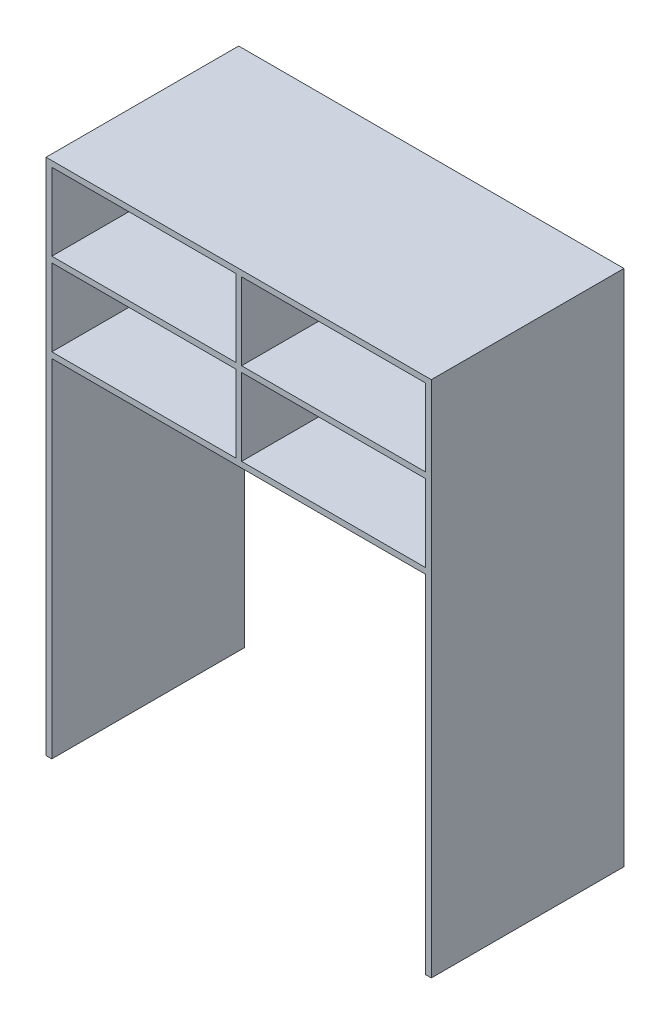
ISO-10303-21;
HEADER;
FILE_DESCRIPTION(('STEP AP214'),'2;1');
FILE_NAME('part.step','',(''),(''),'','','');
FILE_SCHEMA(('AUTOMOTIVE_DESIGN { 1 0 10303 214 1 1 1 1 }'));
ENDSEC;
DATA;
#1=APPLICATION_CONTEXT('core data for automotive mechanical design processes');
#2=APPLICATION_PROTOCOL_DEFINITION('international standard','automotive_design',2000,#1);
#3=PRODUCT_CONTEXT('',#1,'mechanical');
#4=PRODUCT('Part','Part','',(#3));
#5=PRODUCT_RELATED_PRODUCT_CATEGORY('part','',(#4));
#6=PRODUCT_DEFINITION_FORMATION('','',#4);
#7=PRODUCT_DEFINITION_CONTEXT('part definition',#1,'design');
#8=PRODUCT_DEFINITION('design','',#6,#7);
#9=PRODUCT_DEFINITION_SHAPE('','',#8);
#10=(LENGTH_UNIT() NAMED_UNIT(*) SI_UNIT(.MILLI.,.METRE.));
#11=(NAMED_UNIT(*) PLANE_ANGLE_UNIT() SI_UNIT($,.RADIAN.));
#12=(NAMED_UNIT(*) SI_UNIT($,.STERADIAN.) SOLID_ANGLE_UNIT());
#13=UNCERTAINTY_MEASURE_WITH_UNIT(LENGTH_MEASURE(1.E-05),#10,'distance_accuracy_value','');
#14=(GEOMETRIC_REPRESENTATION_CONTEXT(3) GLOBAL_UNCERTAINTY_ASSIGNED_CONTEXT((#13)) GLOBAL_UNIT_ASSIGNED_CONTEXT((#10,
#11,#12)) REPRESENTATION_CONTEXT('',''));
#15=CARTESIAN_POINT('',(0.,0.,0.));
#16=DIRECTION('',(0.,0.,1.));
#17=DIRECTION('',(1.,0.,0.));
#18=AXIS2_PLACEMENT_3D('',#15,#16,#17);
#19=CARTESIAN_POINT('',(0.,0.,100.));
#20=DIRECTION('',(0.,0.,-1.));
#21=DIRECTION('',(-1.,0.,0.));
#22=AXIS2_PLACEMENT_3D('',#19,#20,#21);
#23=PLANE('',#22);
#24=DIRECTION('',(1.,0.,0.));
#25=VECTOR('',#24,1.);
#26=CARTESIAN_POINT('',(97.,45.9999999999998,100.));
#27=LINE('',#26,#25);
#28=CARTESIAN_POINT('',(1.49999999999993,46.,100.));
#29=VERTEX_POINT('',#28);
#30=CARTESIAN_POINT('',(97.,45.9999999999998,100.));
#31=VERTEX_POINT('',#30);
#32=EDGE_CURVE('E238',#29,#31,#27,.T.);
#33=ORIENTED_EDGE('',*,*,#32,.F.);
#34=DIRECTION('',(0.,-1.,0.));
#35=VECTOR('',#34,1.);
#36=CARTESIAN_POINT('',(1.49999999999993,46.,100.));
#37=LINE('',#36,#35);
#38=CARTESIAN_POINT('',(1.49999999999992,85.9999999999994,100.));
#39=VERTEX_POINT('',#38);
#40=EDGE_CURVE('E246',#39,#29,#37,.T.);
#41=ORIENTED_EDGE('',*,*,#40,.F.);
#42=DIRECTION('',(-1.,0.,0.));
#43=VECTOR('',#42,1.);
#44=CARTESIAN_POINT('',(1.49999999999992,85.9999999999994,100.));
#45=LINE('',#44,#43);
#46=CARTESIAN_POINT('',(97.,85.9999999999994,100.));
#47=VERTEX_POINT('',#46);
#48=EDGE_CURVE('E243',#47,#39,#45,.T.);
#49=ORIENTED_EDGE('',*,*,#48,.F.);
#50=DIRECTION('',(0.,1.,0.));
#51=VECTOR('',#50,1.);
#52=CARTESIAN_POINT('',(97.,85.9999999999994,100.));
#53=LINE('',#52,#51);
#54=EDGE_CURVE('E240',#31,#47,#53,.T.);
#55=ORIENTED_EDGE('',*,*,#54,.F.);
#56=EDGE_LOOP('',(#33,#41,#49,#55));
#57=FACE_BOUND('',#56,.T.);
#58=DIRECTION('',(1.,0.,0.));
#59=VECTOR('',#58,1.);
#60=CARTESIAN_POINT('',(-1.50000000000001,3.,100.));
#61=LINE('',#60,#59);
#62=CARTESIAN_POINT('',(-97.,3.00000000000001,100.));
#63=VERTEX_POINT('',#62);
#64=CARTESIAN_POINT('',(-1.50000000000001,3.,100.));
#65=VERTEX_POINT('',#64);
#66=EDGE_CURVE('E300',#63,#65,#61,.T.);
#67=ORIENTED_EDGE('',*,*,#66,.F.);
#68=DIRECTION('',(0.,-1.,0.));
#69=VECTOR('',#68,1.);
#70=CARTESIAN_POINT('',(-97.,3.00000000000001,100.));
#71=LINE('',#70,#69);
#72=CARTESIAN_POINT('',(-97.,43.,100.));
#73=VERTEX_POINT('',#72);
#74=EDGE_CURVE('E308',#73,#63,#71,.T.);
#75=ORIENTED_EDGE('',*,*,#74,.F.);
#76=DIRECTION('',(-1.,0.,0.));
#77=VECTOR('',#76,1.);
#78=CARTESIAN_POINT('',(-97.,43.,100.));
#79=LINE('',#78,#77);
#80=CARTESIAN_POINT('',(-1.50000000000002,43.,100.));
#81=VERTEX_POINT('',#80);
#82=EDGE_CURVE('E305',#81,#73,#79,.T.);
#83=ORIENTED_EDGE('',*,*,#82,.F.);
#84=DIRECTION('',(0.,1.,0.));
#85=VECTOR('',#84,1.);
#86=CARTESIAN_POINT('',(-1.50000000000002,43.,100.));
#87=LINE('',#86,#85);
#88=EDGE_CURVE('E302',#65,#81,#87,.T.);
#89=ORIENTED_EDGE('',*,*,#88,.F.);
#90=EDGE_LOOP('',(#67,#75,#83,#89));
#91=FACE_BOUND('',#90,.T.);
#92=DIRECTION('',(0.,1.,0.));
#93=VECTOR('',#92,1.);
#94=CARTESIAN_POINT('',(-97.,-180.,100.));
#95=LINE('',#94,#93);
#96=CARTESIAN_POINT('',(-97.,-180.,100.));
#97=VERTEX_POINT('',#96);
#98=CARTESIAN_POINT('',(-97.0000000000001,0.,100.));
#99=VERTEX_POINT('',#98);
#100=EDGE_CURVE('E331',#97,#99,#95,.T.);
#101=ORIENTED_EDGE('',*,*,#100,.T.);
#102=DIRECTION('',(1.,0.,0.));
#103=VECTOR('',#102,1.);
#104=CARTESIAN_POINT('',(-97.0000000000001,0.,100.));
#105=LINE('',#104,#103);
#106=CARTESIAN_POINT('',(97.0000000000001,0.,100.));
#107=VERTEX_POINT('',#106);
#108=EDGE_CURVE('E334',#99,#107,#105,.T.);
#109=ORIENTED_EDGE('',*,*,#108,.T.);
#110=DIRECTION('',(0.,-1.,0.));
#111=VECTOR('',#110,1.);
#112=CARTESIAN_POINT('',(97.0000000000001,0.,100.));
#113=LINE('',#112,#111);
#114=CARTESIAN_POINT('',(97.,-180.,100.));
#115=VERTEX_POINT('',#114);
#116=EDGE_CURVE('E337',#107,#115,#113,.T.);
#117=ORIENTED_EDGE('',*,*,#116,.T.);
#118=DIRECTION('',(1.,0.,0.));
#119=VECTOR('',#118,1.);
#120=CARTESIAN_POINT('',(97.,-180.,100.));
#121=LINE('',#120,#119);
#122=CARTESIAN_POINT('',(100.,-180.,100.));
#123=VERTEX_POINT('',#122);
#124=EDGE_CURVE('E339',#115,#123,#121,.T.);
#125=ORIENTED_EDGE('',*,*,#124,.T.);
#126=DIRECTION('',(0.,1.,0.));
#127=VECTOR('',#126,1.);
#128=CARTESIAN_POINT('',(100.,-180.,100.));
#129=LINE('',#128,#127);
#130=CARTESIAN_POINT('',(100.,88.9999999999994,100.));
#131=VERTEX_POINT('',#130);
#132=EDGE_CURVE('E341',#123,#131,#129,.T.);
#133=ORIENTED_EDGE('',*,*,#132,.T.);
#134=DIRECTION('',(-1.,0.,0.));
#135=VECTOR('',#134,1.);
#136=CARTESIAN_POINT('',(100.,88.9999999999994,100.));
#137=LINE('',#136,#135);
#138=CARTESIAN_POINT('',(-100.,88.9999999999994,100.));
#139=VERTEX_POINT('',#138);
#140=EDGE_CURVE('E343',#131,#139,#137,.T.);
#141=ORIENTED_EDGE('',*,*,#140,.T.);
#142=DIRECTION('',(0.,-1.,0.));
#143=VECTOR('',#142,1.);
#144=CARTESIAN_POINT('',(-100.,88.9999999999994,100.));
#145=LINE('',#144,#143);
#146=CARTESIAN_POINT('',(-100.,-180.,100.));
#147=VERTEX_POINT('',#146);
#148=EDGE_CURVE('E345',#139,#147,#145,.T.);
#149=ORIENTED_EDGE('',*,*,#148,.T.);
#150=DIRECTION('',(1.,0.,0.));
#151=VECTOR('',#150,1.);
#152=CARTESIAN_POINT('',(-100.,-180.,100.));
#153=LINE('',#152,#151);
#154=EDGE_CURVE('E347',#147,#97,#153,.T.);
#155=ORIENTED_EDGE('',*,*,#154,.T.);
#156=EDGE_LOOP('',(#101,#109,#117,#125,#133,#141,#149,#155));
#157=FACE_BOUND('',#156,.T.);
#158=DIRECTION('',(1.,0.,0.));
#159=VECTOR('',#158,1.);
#160=CARTESIAN_POINT('',(-1.49999999999993,46.,100.));
#161=LINE('',#160,#159);
#162=CARTESIAN_POINT('',(-97.0000000000001,45.9999999999994,100.));
#163=VERTEX_POINT('',#162);
#164=CARTESIAN_POINT('',(-1.49999999999993,46.,100.));
#165=VERTEX_POINT('',#164);
#166=EDGE_CURVE('E269',#163,#165,#161,.T.);
#167=ORIENTED_EDGE('',*,*,#166,.F.);
#168=DIRECTION('',(0.,-1.,0.));
#169=VECTOR('',#168,1.);
#170=CARTESIAN_POINT('',(-97.0000000000001,45.9999999999994,100.));
#171=LINE('',#170,#169);
#172=CARTESIAN_POINT('',(-97.,85.9999999999994,100.));
#173=VERTEX_POINT('',#172);
#174=EDGE_CURVE('E277',#173,#163,#171,.T.);
#175=ORIENTED_EDGE('',*,*,#174,.F.);
#176=DIRECTION('',(-1.,0.,0.));
#177=VECTOR('',#176,1.);
#178=CARTESIAN_POINT('',(-97.,85.9999999999994,100.));
#179=LINE('',#178,#177);
#180=CARTESIAN_POINT('',(-1.50000000000003,85.9999999999994,100.));
#181=VERTEX_POINT('',#180);
#182=EDGE_CURVE('E274',#181,#173,#179,.T.);
#183=ORIENTED_EDGE('',*,*,#182,.F.);
#184=DIRECTION('',(0.,1.,0.));
#185=VECTOR('',#184,1.);
#186=CARTESIAN_POINT('',(-1.50000000000003,85.9999999999994,100.));
#187=LINE('',#186,#185);
#188=EDGE_CURVE('E271',#165,#181,#187,.T.);
#189=ORIENTED_EDGE('',*,*,#188,.F.);
#190=EDGE_LOOP('',(#167,#175,#183,#189));
#191=FACE_BOUND('',#190,.T.);
#192=DIRECTION('',(-1.,0.,0.));
#193=VECTOR('',#192,1.);
#194=CARTESIAN_POINT('',(1.50000000000002,43.,100.));
#195=LINE('',#194,#193);
#196=CARTESIAN_POINT('',(97.,43.,100.));
#197=VERTEX_POINT('',#196);
#198=CARTESIAN_POINT('',(1.50000000000002,43.,100.));
#199=VERTEX_POINT('',#198);
#200=EDGE_CURVE('E202',#197,#199,#195,.T.);
#201=ORIENTED_EDGE('',*,*,#200,.F.);
#202=DIRECTION('',(0.,1.,0.));
#203=VECTOR('',#202,1.);
#204=CARTESIAN_POINT('',(97.,43.,100.));
#205=LINE('',#204,#203);
#206=CARTESIAN_POINT('',(97.,3.00000000000001,100.));
#207=VERTEX_POINT('',#206);
#208=EDGE_CURVE('E224',#207,#197,#205,.T.);
#209=ORIENTED_EDGE('',*,*,#208,.F.);
#210=DIRECTION('',(1.,0.,0.));
#211=VECTOR('',#210,1.);
#212=CARTESIAN_POINT('',(1.49999999999993,3.,100.));
#213=LINE('',#212,#211);
#214=CARTESIAN_POINT('',(1.49999999999993,3.,100.));
#215=VERTEX_POINT('',#214);
#216=EDGE_CURVE('E222',#215,#207,#213,.T.);
#217=ORIENTED_EDGE('',*,*,#216,.F.);
#218=DIRECTION('',(0.,-1.,0.));
#219=VECTOR('',#218,1.);
#220=CARTESIAN_POINT('',(1.50000000000002,43.,100.));
#221=LINE('',#220,#219);
#222=EDGE_CURVE('E210',#199,#215,#221,.T.);
#223=ORIENTED_EDGE('',*,*,#222,.F.);
#224=EDGE_LOOP('',(#201,#209,#217,#223));
#225=FACE_BOUND('',#224,.T.);
#226=ADVANCED_FACE('F41',(#57,#91,#157,#191,#225),#23,.F.);
#227=CARTESIAN_POINT('',(0.,0.,0.));
#228=DIRECTION('',(0.,0.,-1.));
#229=DIRECTION('',(-1.,0.,0.));
#230=AXIS2_PLACEMENT_3D('',#227,#228,#229);
#231=PLANE('',#230);
#232=DIRECTION('',(0.,1.,0.));
#233=VECTOR('',#232,1.);
#234=CARTESIAN_POINT('',(-97.,-180.,0.));
#235=LINE('',#234,#233);
#236=CARTESIAN_POINT('',(-97.,-180.,0.));
#237=VERTEX_POINT('',#236);
#238=CARTESIAN_POINT('',(-97.0000000000001,0.,0.));
#239=VERTEX_POINT('',#238);
#240=EDGE_CURVE('E330',#237,#239,#235,.T.);
#241=ORIENTED_EDGE('',*,*,#240,.F.);
#242=DIRECTION('',(1.,0.,0.));
#243=VECTOR('',#242,1.);
#244=CARTESIAN_POINT('',(-100.,-180.,0.));
#245=LINE('',#244,#243);
#246=CARTESIAN_POINT('',(-100.,-180.,0.));
#247=VERTEX_POINT('',#246);
#248=EDGE_CURVE('E335',#247,#237,#245,.T.);
#249=ORIENTED_EDGE('',*,*,#248,.F.);
#250=DIRECTION('',(0.,-1.,0.));
#251=VECTOR('',#250,1.);
#252=CARTESIAN_POINT('',(-100.,88.9999999999994,0.));
#253=LINE('',#252,#251);
#254=CARTESIAN_POINT('',(-100.,88.9999999999994,0.));
#255=VERTEX_POINT('',#254);
#256=EDGE_CURVE('E362',#255,#247,#253,.T.);
#257=ORIENTED_EDGE('',*,*,#256,.F.);
#258=DIRECTION('',(-1.,0.,0.));
#259=VECTOR('',#258,1.);
#260=CARTESIAN_POINT('',(100.,88.9999999999994,0.));
#261=LINE('',#260,#259);
#262=CARTESIAN_POINT('',(100.,88.9999999999994,0.));
#263=VERTEX_POINT('',#262);
#264=EDGE_CURVE('E360',#263,#255,#261,.T.);
#265=ORIENTED_EDGE('',*,*,#264,.F.);
#266=DIRECTION('',(0.,1.,0.));
#267=VECTOR('',#266,1.);
#268=CARTESIAN_POINT('',(100.,-180.,0.));
#269=LINE('',#268,#267);
#270=CARTESIAN_POINT('',(100.,-180.,0.));
#271=VERTEX_POINT('',#270);
#272=EDGE_CURVE('E358',#271,#263,#269,.T.);
#273=ORIENTED_EDGE('',*,*,#272,.F.);
#274=DIRECTION('',(1.,0.,0.));
#275=VECTOR('',#274,1.);
#276=CARTESIAN_POINT('',(97.,-180.,0.));
#277=LINE('',#276,#275);
#278=CARTESIAN_POINT('',(97.,-180.,0.));
#279=VERTEX_POINT('',#278);
#280=EDGE_CURVE('E356',#279,#271,#277,.T.);
#281=ORIENTED_EDGE('',*,*,#280,.F.);
#282=DIRECTION('',(0.,-1.,0.));
#283=VECTOR('',#282,1.);
#284=CARTESIAN_POINT('',(97.0000000000001,0.,0.));
#285=LINE('',#284,#283);
#286=CARTESIAN_POINT('',(97.0000000000001,0.,0.));
#287=VERTEX_POINT('',#286);
#288=EDGE_CURVE('E354',#287,#279,#285,.T.);
#289=ORIENTED_EDGE('',*,*,#288,.F.);
#290=DIRECTION('',(1.,0.,0.));
#291=VECTOR('',#290,1.);
#292=CARTESIAN_POINT('',(-97.0000000000001,0.,0.));
#293=LINE('',#292,#291);
#294=EDGE_CURVE('E352',#239,#287,#293,.T.);
#295=ORIENTED_EDGE('',*,*,#294,.F.);
#296=EDGE_LOOP('',(#241,#249,#257,#265,#273,#281,#289,#295));
#297=FACE_BOUND('',#296,.T.);
#298=DIRECTION('',(0.,-1.,0.));
#299=VECTOR('',#298,1.);
#300=CARTESIAN_POINT('',(-97.,3.00000000000001,0.));
#301=LINE('',#300,#299);
#302=CARTESIAN_POINT('',(-97.,43.,0.));
#303=VERTEX_POINT('',#302);
#304=CARTESIAN_POINT('',(-97.,3.00000000000001,0.));
#305=VERTEX_POINT('',#304);
#306=EDGE_CURVE('E303',#303,#305,#301,.T.);
#307=ORIENTED_EDGE('',*,*,#306,.T.);
#308=DIRECTION('',(1.,0.,0.));
#309=VECTOR('',#308,1.);
#310=CARTESIAN_POINT('',(-1.50000000000001,3.,0.));
#311=LINE('',#310,#309);
#312=CARTESIAN_POINT('',(-1.50000000000001,3.,0.));
#313=VERTEX_POINT('',#312);
#314=EDGE_CURVE('E299',#305,#313,#311,.T.);
#315=ORIENTED_EDGE('',*,*,#314,.T.);
#316=DIRECTION('',(0.,1.,0.));
#317=VECTOR('',#316,1.);
#318=CARTESIAN_POINT('',(-1.50000000000002,43.,0.));
#319=LINE('',#318,#317);
#320=CARTESIAN_POINT('',(-1.50000000000002,43.,0.));
#321=VERTEX_POINT('',#320);
#322=EDGE_CURVE('E313',#313,#321,#319,.T.);
#323=ORIENTED_EDGE('',*,*,#322,.T.);
#324=DIRECTION('',(-1.,0.,0.));
#325=VECTOR('',#324,1.);
#326=CARTESIAN_POINT('',(-97.,43.,0.));
#327=LINE('',#326,#325);
#328=EDGE_CURVE('E316',#321,#303,#327,.T.);
#329=ORIENTED_EDGE('',*,*,#328,.T.);
#330=EDGE_LOOP('',(#307,#315,#323,#329));
#331=FACE_BOUND('',#330,.T.);
#332=DIRECTION('',(0.,-1.,0.));
#333=VECTOR('',#332,1.);
#334=CARTESIAN_POINT('',(-97.0000000000001,45.9999999999994,0.));
#335=LINE('',#334,#333);
#336=CARTESIAN_POINT('',(-97.,85.9999999999994,0.));
#337=VERTEX_POINT('',#336);
#338=CARTESIAN_POINT('',(-97.0000000000001,45.9999999999994,0.));
#339=VERTEX_POINT('',#338);
#340=EDGE_CURVE('E272',#337,#339,#335,.T.);
#341=ORIENTED_EDGE('',*,*,#340,.T.);
#342=DIRECTION('',(1.,0.,0.));
#343=VECTOR('',#342,1.);
#344=CARTESIAN_POINT('',(-1.49999999999993,46.,0.));
#345=LINE('',#344,#343);
#346=CARTESIAN_POINT('',(-1.49999999999993,46.,0.));
#347=VERTEX_POINT('',#346);
#348=EDGE_CURVE('E268',#339,#347,#345,.T.);
#349=ORIENTED_EDGE('',*,*,#348,.T.);
#350=DIRECTION('',(0.,1.,0.));
#351=VECTOR('',#350,1.);
#352=CARTESIAN_POINT('',(-1.50000000000003,85.9999999999994,0.));
#353=LINE('',#352,#351);
#354=CARTESIAN_POINT('',(-1.50000000000003,85.9999999999994,0.));
#355=VERTEX_POINT('',#354);
#356=EDGE_CURVE('E282',#347,#355,#353,.T.);
#357=ORIENTED_EDGE('',*,*,#356,.T.);
#358=DIRECTION('',(-1.,0.,0.));
#359=VECTOR('',#358,1.);
#360=CARTESIAN_POINT('',(-97.,85.9999999999994,0.));
#361=LINE('',#360,#359);
#362=EDGE_CURVE('E285',#355,#337,#361,.T.);
#363=ORIENTED_EDGE('',*,*,#362,.T.);
#364=EDGE_LOOP('',(#341,#349,#357,#363));
#365=FACE_BOUND('',#364,.T.);
#366=DIRECTION('',(0.,-1.,0.));
#367=VECTOR('',#366,1.);
#368=CARTESIAN_POINT('',(1.49999999999993,46.,0.));
#369=LINE('',#368,#367);
#370=CARTESIAN_POINT('',(1.49999999999992,85.9999999999994,0.));
#371=VERTEX_POINT('',#370);
#372=CARTESIAN_POINT('',(1.49999999999993,46.,0.));
#373=VERTEX_POINT('',#372);
#374=EDGE_CURVE('E241',#371,#373,#369,.T.);
#375=ORIENTED_EDGE('',*,*,#374,.T.);
#376=DIRECTION('',(1.,0.,0.));
#377=VECTOR('',#376,1.);
#378=CARTESIAN_POINT('',(97.,45.9999999999998,0.));
#379=LINE('',#378,#377);
#380=CARTESIAN_POINT('',(97.,45.9999999999998,0.));
#381=VERTEX_POINT('',#380);
#382=EDGE_CURVE('E218',#373,#381,#379,.T.);
#383=ORIENTED_EDGE('',*,*,#382,.T.);
#384=DIRECTION('',(0.,1.,0.));
#385=VECTOR('',#384,1.);
#386=CARTESIAN_POINT('',(97.,85.9999999999994,0.));
#387=LINE('',#386,#385);
#388=CARTESIAN_POINT('',(97.,85.9999999999994,0.));
#389=VERTEX_POINT('',#388);
#390=EDGE_CURVE('E251',#381,#389,#387,.T.);
#391=ORIENTED_EDGE('',*,*,#390,.T.);
#392=DIRECTION('',(-1.,0.,0.));
#393=VECTOR('',#392,1.);
#394=CARTESIAN_POINT('',(1.49999999999992,85.9999999999994,0.));
#395=LINE('',#394,#393);
#396=EDGE_CURVE('E254',#389,#371,#395,.T.);
#397=ORIENTED_EDGE('',*,*,#396,.T.);
#398=EDGE_LOOP('',(#375,#383,#391,#397));
#399=FACE_BOUND('',#398,.T.);
#400=DIRECTION('',(0.,1.,0.));
#401=VECTOR('',#400,1.);
#402=CARTESIAN_POINT('',(97.,43.,0.));
#403=LINE('',#402,#401);
#404=CARTESIAN_POINT('',(97.,3.00000000000001,0.));
#405=VERTEX_POINT('',#404);
#406=CARTESIAN_POINT('',(97.,43.,0.));
#407=VERTEX_POINT('',#406);
#408=EDGE_CURVE('E211',#405,#407,#403,.T.);
#409=ORIENTED_EDGE('',*,*,#408,.T.);
#410=DIRECTION('',(-1.,0.,0.));
#411=VECTOR('',#410,1.);
#412=CARTESIAN_POINT('',(1.50000000000002,43.,0.));
#413=LINE('',#412,#411);
#414=CARTESIAN_POINT('',(1.50000000000002,43.,0.));
#415=VERTEX_POINT('',#414);
#416=EDGE_CURVE('E64',#407,#415,#413,.T.);
#417=ORIENTED_EDGE('',*,*,#416,.T.);
#418=DIRECTION('',(0.,-1.,0.));
#419=VECTOR('',#418,1.);
#420=CARTESIAN_POINT('',(1.50000000000002,43.,0.));
#421=LINE('',#420,#419);
#422=CARTESIAN_POINT('',(1.49999999999993,3.,0.));
#423=VERTEX_POINT('',#422);
#424=EDGE_CURVE('E217',#415,#423,#421,.T.);
#425=ORIENTED_EDGE('',*,*,#424,.T.);
#426=DIRECTION('',(1.,0.,0.));
#427=VECTOR('',#426,1.);
#428=CARTESIAN_POINT('',(1.49999999999993,3.,0.));
#429=LINE('',#428,#427);
#430=EDGE_CURVE('E230',#423,#405,#429,.T.);
#431=ORIENTED_EDGE('',*,*,#430,.T.);
#432=EDGE_LOOP('',(#409,#417,#425,#431));
#433=FACE_BOUND('',#432,.T.);
#434=ADVANCED_FACE('F392',(#297,#331,#365,#399,#433),#231,.T.);
#435=CARTESIAN_POINT('',(-97.,-180.,100.));
#436=DIRECTION('',(-1.,0.,0.));
#437=DIRECTION('',(0.,-1.,0.));
#438=AXIS2_PLACEMENT_3D('',#435,#436,#437);
#439=PLANE('',#438);
#440=ORIENTED_EDGE('',*,*,#240,.T.);
#441=DIRECTION('',(0.,0.,-1.));
#442=VECTOR('',#441,1.);
#443=CARTESIAN_POINT('',(-97.0000000000001,0.,100.));
#444=LINE('',#443,#442);
#445=EDGE_CURVE('E11',#99,#239,#444,.T.);
#446=ORIENTED_EDGE('',*,*,#445,.F.);
#447=ORIENTED_EDGE('',*,*,#100,.F.);
#448=DIRECTION('',(0.,0.,-1.));
#449=VECTOR('',#448,1.);
#450=CARTESIAN_POINT('',(-97.,-180.,100.));
#451=LINE('',#450,#449);
#452=EDGE_CURVE('E349',#97,#237,#451,.T.);
#453=ORIENTED_EDGE('',*,*,#452,.T.);
#454=EDGE_LOOP('',(#440,#446,#447,#453));
#455=FACE_BOUND('',#454,.T.);
#456=ADVANCED_FACE('F43',(#455),#439,.F.);
#457=CARTESIAN_POINT('',(-97.0000000000001,0.,100.));
#458=DIRECTION('',(0.,1.,0.));
#459=DIRECTION('',(0.,0.,1.));
#460=AXIS2_PLACEMENT_3D('',#457,#458,#459);
#461=PLANE('',#460);
#462=ORIENTED_EDGE('',*,*,#294,.T.);
#463=DIRECTION('',(0.,0.,-1.));
#464=VECTOR('',#463,1.);
#465=CARTESIAN_POINT('',(97.0000000000001,0.,100.));
#466=LINE('',#465,#464);
#467=EDGE_CURVE('E49',#107,#287,#466,.T.);
#468=ORIENTED_EDGE('',*,*,#467,.F.);
#469=ORIENTED_EDGE('',*,*,#108,.F.);
#470=ORIENTED_EDGE('',*,*,#445,.T.);
#471=EDGE_LOOP('',(#462,#468,#469,#470));
#472=FACE_BOUND('',#471,.T.);
#473=ADVANCED_FACE('F410',(#472),#461,.F.);
#474=CARTESIAN_POINT('',(97.0000000000001,0.,100.));
#475=DIRECTION('',(1.,0.,0.));
#476=DIRECTION('',(0.,1.,0.));
#477=AXIS2_PLACEMENT_3D('',#474,#475,#476);
#478=PLANE('',#477);
#479=ORIENTED_EDGE('',*,*,#288,.T.);
#480=DIRECTION('',(0.,0.,-1.));
#481=VECTOR('',#480,1.);
#482=CARTESIAN_POINT('',(97.,-180.,100.));
#483=LINE('',#482,#481);
#484=EDGE_CURVE('E379',#115,#279,#483,.T.);
#485=ORIENTED_EDGE('',*,*,#484,.F.);
#486=ORIENTED_EDGE('',*,*,#116,.F.);
#487=ORIENTED_EDGE('',*,*,#467,.T.);
#488=EDGE_LOOP('',(#479,#485,#486,#487));
#489=FACE_BOUND('',#488,.T.);
#490=ADVANCED_FACE('F386',(#489),#478,.F.);
#491=CARTESIAN_POINT('',(97.,-180.,100.));
#492=DIRECTION('',(0.,1.,0.));
#493=DIRECTION('',(0.,0.,1.));
#494=AXIS2_PLACEMENT_3D('',#491,#492,#493);
#495=PLANE('',#494);
#496=ORIENTED_EDGE('',*,*,#280,.T.);
#497=DIRECTION('',(0.,0.,-1.));
#498=VECTOR('',#497,1.);
#499=CARTESIAN_POINT('',(100.,-180.,100.));
#500=LINE('',#499,#498);
#501=EDGE_CURVE('E376',#123,#271,#500,.T.);
#502=ORIENTED_EDGE('',*,*,#501,.F.);
#503=ORIENTED_EDGE('',*,*,#124,.F.);
#504=ORIENTED_EDGE('',*,*,#484,.T.);
#505=EDGE_LOOP('',(#496,#502,#503,#504));
#506=FACE_BOUND('',#505,.T.);
#507=ADVANCED_FACE('F398',(#506),#495,.F.);
#508=CARTESIAN_POINT('',(100.,-180.,100.));
#509=DIRECTION('',(-1.,0.,0.));
#510=DIRECTION('',(0.,0.,1.));
#511=AXIS2_PLACEMENT_3D('',#508,#509,#510);
#512=PLANE('',#511);
#513=ORIENTED_EDGE('',*,*,#272,.T.);
#514=DIRECTION('',(0.,0.,-1.));
#515=VECTOR('',#514,1.);
#516=CARTESIAN_POINT('',(100.,88.9999999999994,100.));
#517=LINE('',#516,#515);
#518=EDGE_CURVE('E373',#131,#263,#517,.T.);
#519=ORIENTED_EDGE('',*,*,#518,.F.);
#520=ORIENTED_EDGE('',*,*,#132,.F.);
#521=ORIENTED_EDGE('',*,*,#501,.T.);
#522=EDGE_LOOP('',(#513,#519,#520,#521));
#523=FACE_BOUND('',#522,.T.);
#524=ADVANCED_FACE('F402',(#523),#512,.F.);
#525=CARTESIAN_POINT('',(100.,88.9999999999994,100.));
#526=DIRECTION('',(0.,-1.,0.));
#527=DIRECTION('',(1.,0.,0.));
#528=AXIS2_PLACEMENT_3D('',#525,#526,#527);
#529=PLANE('',#528);
#530=ORIENTED_EDGE('',*,*,#264,.T.);
#531=DIRECTION('',(0.,0.,-1.));
#532=VECTOR('',#531,1.);
#533=CARTESIAN_POINT('',(-100.,88.9999999999994,100.));
#534=LINE('',#533,#532);
#535=EDGE_CURVE('E370',#139,#255,#534,.T.);
#536=ORIENTED_EDGE('',*,*,#535,.F.);
#537=ORIENTED_EDGE('',*,*,#140,.F.);
#538=ORIENTED_EDGE('',*,*,#518,.T.);
#539=EDGE_LOOP('',(#530,#536,#537,#538));
#540=FACE_BOUND('',#539,.T.);
#541=ADVANCED_FACE('F423',(#540),#529,.F.);
#542=CARTESIAN_POINT('',(-100.,88.9999999999994,100.));
#543=DIRECTION('',(1.,0.,0.));
#544=DIRECTION('',(0.,0.,-1.));
#545=AXIS2_PLACEMENT_3D('',#542,#543,#544);
#546=PLANE('',#545);
#547=ORIENTED_EDGE('',*,*,#256,.T.);
#548=DIRECTION('',(0.,0.,-1.));
#549=VECTOR('',#548,1.);
#550=CARTESIAN_POINT('',(-100.,-180.,100.));
#551=LINE('',#550,#549);
#552=EDGE_CURVE('E367',#147,#247,#551,.T.);
#553=ORIENTED_EDGE('',*,*,#552,.F.);
#554=ORIENTED_EDGE('',*,*,#148,.F.);
#555=ORIENTED_EDGE('',*,*,#535,.T.);
#556=EDGE_LOOP('',(#547,#553,#554,#555));
#557=FACE_BOUND('',#556,.T.);
#558=ADVANCED_FACE('F421',(#557),#546,.F.);
#559=CARTESIAN_POINT('',(-100.,-180.,100.));
#560=DIRECTION('',(0.,1.,0.));
#561=DIRECTION('',(0.,0.,1.));
#562=AXIS2_PLACEMENT_3D('',#559,#560,#561);
#563=PLANE('',#562);
#564=ORIENTED_EDGE('',*,*,#248,.T.);
#565=ORIENTED_EDGE('',*,*,#452,.F.);
#566=ORIENTED_EDGE('',*,*,#154,.F.);
#567=ORIENTED_EDGE('',*,*,#552,.T.);
#568=EDGE_LOOP('',(#564,#565,#566,#567));
#569=FACE_BOUND('',#568,.T.);
#570=ADVANCED_FACE('F416',(#569),#563,.F.);
#571=CARTESIAN_POINT('',(-1.50000000000001,3.,100.));
#572=DIRECTION('',(0.,1.,0.));
#573=DIRECTION('',(-1.,0.,0.));
#574=AXIS2_PLACEMENT_3D('',#571,#572,#573);
#575=PLANE('',#574);
#576=ORIENTED_EDGE('',*,*,#314,.F.);
#577=DIRECTION('',(0.,0.,-1.));
#578=VECTOR('',#577,1.);
#579=CARTESIAN_POINT('',(-97.,3.00000000000001,100.));
#580=LINE('',#579,#578);
#581=EDGE_CURVE('E310',#63,#305,#580,.T.);
#582=ORIENTED_EDGE('',*,*,#581,.F.);
#583=ORIENTED_EDGE('',*,*,#66,.T.);
#584=DIRECTION('',(0.,0.,-1.));
#585=VECTOR('',#584,1.);
#586=CARTESIAN_POINT('',(-1.50000000000001,3.,100.));
#587=LINE('',#586,#585);
#588=EDGE_CURVE('E327',#65,#313,#587,.T.);
#589=ORIENTED_EDGE('',*,*,#588,.T.);
#590=EDGE_LOOP('',(#576,#582,#583,#589));
#591=FACE_BOUND('',#590,.T.);
#592=ADVANCED_FACE('F442',(#591),#575,.T.);
#593=CARTESIAN_POINT('',(-1.50000000000002,43.,100.));
#594=DIRECTION('',(-1.,0.,0.));
#595=DIRECTION('',(0.,-1.,0.));
#596=AXIS2_PLACEMENT_3D('',#593,#594,#595);
#597=PLANE('',#596);
#598=ORIENTED_EDGE('',*,*,#322,.F.);
#599=ORIENTED_EDGE('',*,*,#588,.F.);
#600=ORIENTED_EDGE('',*,*,#88,.T.);
#601=DIRECTION('',(0.,0.,-1.));
#602=VECTOR('',#601,1.);
#603=CARTESIAN_POINT('',(-1.50000000000002,43.,100.));
#604=LINE('',#603,#602);
#605=EDGE_CURVE('E325',#81,#321,#604,.T.);
#606=ORIENTED_EDGE('',*,*,#605,.T.);
#607=EDGE_LOOP('',(#598,#599,#600,#606));
#608=FACE_BOUND('',#607,.T.);
#609=ADVANCED_FACE('F449',(#608),#597,.T.);
#610=CARTESIAN_POINT('',(-97.,43.,100.));
#611=DIRECTION('',(0.,-1.,0.));
#612=DIRECTION('',(1.,0.,0.));
#613=AXIS2_PLACEMENT_3D('',#610,#611,#612);
#614=PLANE('',#613);
#615=ORIENTED_EDGE('',*,*,#328,.F.);
#616=ORIENTED_EDGE('',*,*,#605,.F.);
#617=ORIENTED_EDGE('',*,*,#82,.T.);
#618=DIRECTION('',(0.,0.,-1.));
#619=VECTOR('',#618,1.);
#620=CARTESIAN_POINT('',(-97.,43.,100.));
#621=LINE('',#620,#619);
#622=EDGE_CURVE('E323',#73,#303,#621,.T.);
#623=ORIENTED_EDGE('',*,*,#622,.T.);
#624=EDGE_LOOP('',(#615,#616,#617,#623));
#625=FACE_BOUND('',#624,.T.);
#626=ADVANCED_FACE('F454',(#625),#614,.T.);
#627=CARTESIAN_POINT('',(-97.,3.00000000000001,100.));
#628=DIRECTION('',(1.,0.,0.));
#629=DIRECTION('',(0.,0.,-1.));
#630=AXIS2_PLACEMENT_3D('',#627,#628,#629);
#631=PLANE('',#630);
#632=ORIENTED_EDGE('',*,*,#306,.F.);
#633=ORIENTED_EDGE('',*,*,#622,.F.);
#634=ORIENTED_EDGE('',*,*,#74,.T.);
#635=ORIENTED_EDGE('',*,*,#581,.T.);
#636=EDGE_LOOP('',(#632,#633,#634,#635));
#637=FACE_BOUND('',#636,.T.);
#638=ADVANCED_FACE('F461',(#637),#631,.T.);
#639=CARTESIAN_POINT('',(-1.49999999999993,46.,100.));
#640=DIRECTION('',(0.,1.,0.));
#641=DIRECTION('',(-1.,0.,0.));
#642=AXIS2_PLACEMENT_3D('',#639,#640,#641);
#643=PLANE('',#642);
#644=ORIENTED_EDGE('',*,*,#348,.F.);
#645=DIRECTION('',(0.,0.,-1.));
#646=VECTOR('',#645,1.);
#647=CARTESIAN_POINT('',(-97.0000000000001,45.9999999999994,100.));
#648=LINE('',#647,#646);
#649=EDGE_CURVE('E279',#163,#339,#648,.T.);
#650=ORIENTED_EDGE('',*,*,#649,.F.);
#651=ORIENTED_EDGE('',*,*,#166,.T.);
#652=DIRECTION('',(0.,0.,-1.));
#653=VECTOR('',#652,1.);
#654=CARTESIAN_POINT('',(-1.49999999999993,46.,100.));
#655=LINE('',#654,#653);
#656=EDGE_CURVE('E296',#165,#347,#655,.T.);
#657=ORIENTED_EDGE('',*,*,#656,.T.);
#658=EDGE_LOOP('',(#644,#650,#651,#657));
#659=FACE_BOUND('',#658,.T.);
#660=ADVANCED_FACE('F474',(#659),#643,.T.);
#661=CARTESIAN_POINT('',(-1.50000000000003,85.9999999999994,100.));
#662=DIRECTION('',(-1.,0.,0.));
#663=DIRECTION('',(0.,-1.,0.));
#664=AXIS2_PLACEMENT_3D('',#661,#662,#663);
#665=PLANE('',#664);
#666=ORIENTED_EDGE('',*,*,#356,.F.);
#667=ORIENTED_EDGE('',*,*,#656,.F.);
#668=ORIENTED_EDGE('',*,*,#188,.T.);
#669=DIRECTION('',(0.,0.,-1.));
#670=VECTOR('',#669,1.);
#671=CARTESIAN_POINT('',(-1.50000000000003,85.9999999999994,100.));
#672=LINE('',#671,#670);
#673=EDGE_CURVE('E294',#181,#355,#672,.T.);
#674=ORIENTED_EDGE('',*,*,#673,.T.);
#675=EDGE_LOOP('',(#666,#667,#668,#674));
#676=FACE_BOUND('',#675,.T.);
#677=ADVANCED_FACE('F479',(#676),#665,.T.);
#678=CARTESIAN_POINT('',(-97.,85.9999999999994,100.));
#679=DIRECTION('',(0.,-1.,0.));
#680=DIRECTION('',(1.,0.,0.));
#681=AXIS2_PLACEMENT_3D('',#678,#679,#680);
#682=PLANE('',#681);
#683=ORIENTED_EDGE('',*,*,#362,.F.);
#684=ORIENTED_EDGE('',*,*,#673,.F.);
#685=ORIENTED_EDGE('',*,*,#182,.T.);
#686=DIRECTION('',(0.,0.,-1.));
#687=VECTOR('',#686,1.);
#688=CARTESIAN_POINT('',(-97.,85.9999999999994,100.));
#689=LINE('',#688,#687);
#690=EDGE_CURVE('E292',#173,#337,#689,.T.);
#691=ORIENTED_EDGE('',*,*,#690,.T.);
#692=EDGE_LOOP('',(#683,#684,#685,#691));
#693=FACE_BOUND('',#692,.T.);
#694=ADVANCED_FACE('F483',(#693),#682,.T.);
#695=CARTESIAN_POINT('',(-97.0000000000001,45.9999999999994,100.));
#696=DIRECTION('',(1.,0.,0.));
#697=DIRECTION('',(0.,1.,0.));
#698=AXIS2_PLACEMENT_3D('',#695,#696,#697);
#699=PLANE('',#698);
#700=ORIENTED_EDGE('',*,*,#340,.F.);
#701=ORIENTED_EDGE('',*,*,#690,.F.);
#702=ORIENTED_EDGE('',*,*,#174,.T.);
#703=ORIENTED_EDGE('',*,*,#649,.T.);
#704=EDGE_LOOP('',(#700,#701,#702,#703));
#705=FACE_BOUND('',#704,.T.);
#706=ADVANCED_FACE('F487',(#705),#699,.T.);
#707=CARTESIAN_POINT('',(97.,45.9999999999998,100.));
#708=DIRECTION('',(0.,1.,0.));
#709=DIRECTION('',(-1.,0.,0.));
#710=AXIS2_PLACEMENT_3D('',#707,#708,#709);
#711=PLANE('',#710);
#712=ORIENTED_EDGE('',*,*,#382,.F.);
#713=DIRECTION('',(0.,0.,-1.));
#714=VECTOR('',#713,1.);
#715=CARTESIAN_POINT('',(1.49999999999993,46.,100.));
#716=LINE('',#715,#714);
#717=EDGE_CURVE('E248',#29,#373,#716,.T.);
#718=ORIENTED_EDGE('',*,*,#717,.F.);
#719=ORIENTED_EDGE('',*,*,#32,.T.);
#720=DIRECTION('',(0.,0.,-1.));
#721=VECTOR('',#720,1.);
#722=CARTESIAN_POINT('',(97.,45.9999999999998,100.));
#723=LINE('',#722,#721);
#724=EDGE_CURVE('E265',#31,#381,#723,.T.);
#725=ORIENTED_EDGE('',*,*,#724,.T.);
#726=EDGE_LOOP('',(#712,#718,#719,#725));
#727=FACE_BOUND('',#726,.T.);
#728=ADVANCED_FACE('F491',(#727),#711,.T.);
#729=CARTESIAN_POINT('',(97.,85.9999999999994,100.));
#730=DIRECTION('',(-1.,0.,0.));
#731=DIRECTION('',(0.,0.,1.));
#732=AXIS2_PLACEMENT_3D('',#729,#730,#731);
#733=PLANE('',#732);
#734=ORIENTED_EDGE('',*,*,#390,.F.);
#735=ORIENTED_EDGE('',*,*,#724,.F.);
#736=ORIENTED_EDGE('',*,*,#54,.T.);
#737=DIRECTION('',(0.,0.,-1.));
#738=VECTOR('',#737,1.);
#739=CARTESIAN_POINT('',(97.,85.9999999999994,100.));
#740=LINE('',#739,#738);
#741=EDGE_CURVE('E263',#47,#389,#740,.T.);
#742=ORIENTED_EDGE('',*,*,#741,.T.);
#743=EDGE_LOOP('',(#734,#735,#736,#742));
#744=FACE_BOUND('',#743,.T.);
#745=ADVANCED_FACE('F495',(#744),#733,.T.);
#746=CARTESIAN_POINT('',(1.49999999999992,85.9999999999994,100.));
#747=DIRECTION('',(0.,-1.,0.));
#748=DIRECTION('',(1.,0.,0.));
#749=AXIS2_PLACEMENT_3D('',#746,#747,#748);
#750=PLANE('',#749);
#751=ORIENTED_EDGE('',*,*,#396,.F.);
#752=ORIENTED_EDGE('',*,*,#741,.F.);
#753=ORIENTED_EDGE('',*,*,#48,.T.);
#754=DIRECTION('',(0.,0.,-1.));
#755=VECTOR('',#754,1.);
#756=CARTESIAN_POINT('',(1.49999999999992,85.9999999999994,100.));
#757=LINE('',#756,#755);
#758=EDGE_CURVE('E261',#39,#371,#757,.T.);
#759=ORIENTED_EDGE('',*,*,#758,.T.);
#760=EDGE_LOOP('',(#751,#752,#753,#759));
#761=FACE_BOUND('',#760,.T.);
#762=ADVANCED_FACE('F499',(#761),#750,.T.);
#763=CARTESIAN_POINT('',(1.49999999999993,46.,100.));
#764=DIRECTION('',(1.,0.,0.));
#765=DIRECTION('',(0.,1.,0.));
#766=AXIS2_PLACEMENT_3D('',#763,#764,#765);
#767=PLANE('',#766);
#768=ORIENTED_EDGE('',*,*,#374,.F.);
#769=ORIENTED_EDGE('',*,*,#758,.F.);
#770=ORIENTED_EDGE('',*,*,#40,.T.);
#771=ORIENTED_EDGE('',*,*,#717,.T.);
#772=EDGE_LOOP('',(#768,#769,#770,#771));
#773=FACE_BOUND('',#772,.T.);
#774=ADVANCED_FACE('F503',(#773),#767,.T.);
#775=CARTESIAN_POINT('',(1.50000000000002,43.,100.));
#776=DIRECTION('',(0.,-1.,0.));
#777=DIRECTION('',(1.,0.,0.));
#778=AXIS2_PLACEMENT_3D('',#775,#776,#777);
#779=PLANE('',#778);
#780=ORIENTED_EDGE('',*,*,#416,.F.);
#781=DIRECTION('',(0.,0.,-1.));
#782=VECTOR('',#781,1.);
#783=CARTESIAN_POINT('',(97.,43.,100.));
#784=LINE('',#783,#782);
#785=EDGE_CURVE('E206',#197,#407,#784,.T.);
#786=ORIENTED_EDGE('',*,*,#785,.F.);
#787=ORIENTED_EDGE('',*,*,#200,.T.);
#788=DIRECTION('',(0.,0.,-1.));
#789=VECTOR('',#788,1.);
#790=CARTESIAN_POINT('',(1.50000000000002,43.,100.));
#791=LINE('',#790,#789);
#792=EDGE_CURVE('E205',#199,#415,#791,.T.);
#793=ORIENTED_EDGE('',*,*,#792,.T.);
#794=EDGE_LOOP('',(#780,#786,#787,#793));
#795=FACE_BOUND('',#794,.T.);
#796=ADVANCED_FACE('F204',(#795),#779,.T.);
#797=CARTESIAN_POINT('',(1.50000000000002,43.,100.));
#798=DIRECTION('',(1.,0.,0.));
#799=DIRECTION('',(0.,1.,0.));
#800=AXIS2_PLACEMENT_3D('',#797,#798,#799);
#801=PLANE('',#800);
#802=ORIENTED_EDGE('',*,*,#424,.F.);
#803=ORIENTED_EDGE('',*,*,#792,.F.);
#804=ORIENTED_EDGE('',*,*,#222,.T.);
#805=DIRECTION('',(0.,0.,-1.));
#806=VECTOR('',#805,1.);
#807=CARTESIAN_POINT('',(1.49999999999993,3.,100.));
#808=LINE('',#807,#806);
#809=EDGE_CURVE('E219',#215,#423,#808,.T.);
#810=ORIENTED_EDGE('',*,*,#809,.T.);
#811=EDGE_LOOP('',(#802,#803,#804,#810));
#812=FACE_BOUND('',#811,.T.);
#813=ADVANCED_FACE('F214',(#812),#801,.T.);
#814=CARTESIAN_POINT('',(1.49999999999993,3.,100.));
#815=DIRECTION('',(0.,1.,0.));
#816=DIRECTION('',(-1.,0.,0.));
#817=AXIS2_PLACEMENT_3D('',#814,#815,#816);
#818=PLANE('',#817);
#819=ORIENTED_EDGE('',*,*,#430,.F.);
#820=ORIENTED_EDGE('',*,*,#809,.F.);
#821=ORIENTED_EDGE('',*,*,#216,.T.);
#822=DIRECTION('',(0.,0.,-1.));
#823=VECTOR('',#822,1.);
#824=CARTESIAN_POINT('',(97.,3.00000000000001,100.));
#825=LINE('',#824,#823);
#826=EDGE_CURVE('E56',#207,#405,#825,.T.);
#827=ORIENTED_EDGE('',*,*,#826,.T.);
#828=EDGE_LOOP('',(#819,#820,#821,#827));
#829=FACE_BOUND('',#828,.T.);
#830=ADVANCED_FACE('F512',(#829),#818,.T.);
#831=CARTESIAN_POINT('',(97.,43.,100.));
#832=DIRECTION('',(-1.,0.,0.));
#833=DIRECTION('',(0.,0.,1.));
#834=AXIS2_PLACEMENT_3D('',#831,#832,#833);
#835=PLANE('',#834);
#836=ORIENTED_EDGE('',*,*,#408,.F.);
#837=ORIENTED_EDGE('',*,*,#826,.F.);
#838=ORIENTED_EDGE('',*,*,#208,.T.);
#839=ORIENTED_EDGE('',*,*,#785,.T.);
#840=EDGE_LOOP('',(#836,#837,#838,#839));
#841=FACE_BOUND('',#840,.T.);
#842=ADVANCED_FACE('F515',(#841),#835,.T.);
#843=CLOSED_SHELL('',(#226,#434,#456,#473,#490,#507,#524,#541,#558,#570,#592,#609,#626,#638,
#660,#677,#694,#706,#728,#745,#762,#774,#796,#813,#830,#842));
#844=MANIFOLD_SOLID_BREP('B2',#843);
#845=ADVANCED_BREP_SHAPE_REPRESENTATION('',(#18,#844),#14);
#846=SHAPE_DEFINITION_REPRESENTATION(#9,#845);
ENDSEC;
END-ISO-10303-21;
